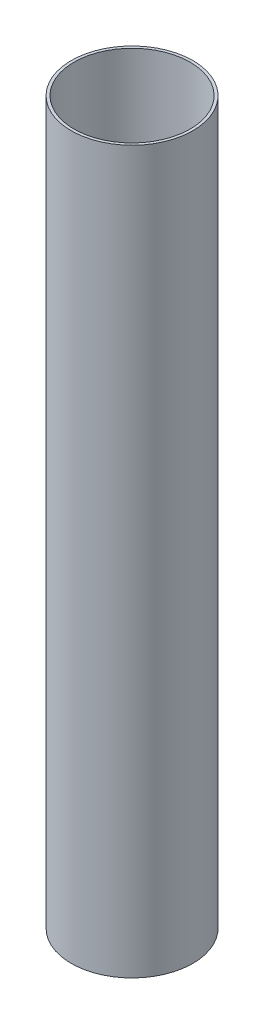
ISO-10303-21;
HEADER;
FILE_DESCRIPTION(('STEP AP214'),'2;1');
FILE_NAME('part.step','',(''),(''),'','','');
FILE_SCHEMA(('AUTOMOTIVE_DESIGN { 1 0 10303 214 1 1 1 1 }'));
ENDSEC;
DATA;
#1=APPLICATION_CONTEXT('core data for automotive mechanical design processes');
#2=APPLICATION_PROTOCOL_DEFINITION('international standard','automotive_design',2000,#1);
#3=PRODUCT_CONTEXT('',#1,'mechanical');
#4=PRODUCT('Part','Part','',(#3));
#5=PRODUCT_RELATED_PRODUCT_CATEGORY('part','',(#4));
#6=PRODUCT_DEFINITION_FORMATION('','',#4);
#7=PRODUCT_DEFINITION_CONTEXT('part definition',#1,'design');
#8=PRODUCT_DEFINITION('design','',#6,#7);
#9=PRODUCT_DEFINITION_SHAPE('','',#8);
#10=(LENGTH_UNIT() NAMED_UNIT(*) SI_UNIT(.MILLI.,.METRE.));
#11=(NAMED_UNIT(*) PLANE_ANGLE_UNIT() SI_UNIT($,.RADIAN.));
#12=(NAMED_UNIT(*) SI_UNIT($,.STERADIAN.) SOLID_ANGLE_UNIT());
#13=UNCERTAINTY_MEASURE_WITH_UNIT(LENGTH_MEASURE(1.E-05),#10,'distance_accuracy_value','');
#14=(GEOMETRIC_REPRESENTATION_CONTEXT(3) GLOBAL_UNCERTAINTY_ASSIGNED_CONTEXT((#13)) GLOBAL_UNIT_ASSIGNED_CONTEXT((#10,
#11,#12)) REPRESENTATION_CONTEXT('',''));
#15=CARTESIAN_POINT('',(0.,0.,0.));
#16=DIRECTION('',(0.,0.,1.));
#17=DIRECTION('',(1.,0.,0.));
#18=AXIS2_PLACEMENT_3D('',#15,#16,#17);
#19=CARTESIAN_POINT('',(0.,1299.,0.));
#20=DIRECTION('',(0.,1.,0.));
#21=DIRECTION('',(0.,0.,1.));
#22=AXIS2_PLACEMENT_3D('',#19,#20,#21);
#23=PLANE('',#22);
#24=CARTESIAN_POINT('',(0.,1299.,0.));
#25=DIRECTION('',(0.,1.,0.));
#26=DIRECTION('',(0.,0.,1.));
#27=AXIS2_PLACEMENT_3D('',#24,#25,#26);
#28=CIRCLE('',#27,109.55);
#29=CARTESIAN_POINT('',(0.,1299.,-109.55));
#30=VERTEX_POINT('',#29);
#31=EDGE_CURVE('E11',#30,#30,#28,.T.);
#32=ORIENTED_EDGE('',*,*,#31,.T.);
#33=EDGE_LOOP('',(#32));
#34=FACE_BOUND('',#33,.T.);
#35=CARTESIAN_POINT('',(0.,1299.,0.));
#36=DIRECTION('',(0.,1.,0.));
#37=DIRECTION('',(1.,0.,0.));
#38=AXIS2_PLACEMENT_3D('',#35,#36,#37);
#39=CIRCLE('',#38,104.55);
#40=CARTESIAN_POINT('',(0.,1299.,-104.55));
#41=VERTEX_POINT('',#40);
#42=EDGE_CURVE('E50',#41,#41,#39,.T.);
#43=ORIENTED_EDGE('',*,*,#42,.F.);
#44=EDGE_LOOP('',(#43));
#45=FACE_BOUND('',#44,.T.);
#46=ADVANCED_FACE('F39',(#34,#45),#23,.T.);
#47=CARTESIAN_POINT('',(0.,0.,0.));
#48=DIRECTION('',(0.,1.,0.));
#49=DIRECTION('',(0.,0.,1.));
#50=AXIS2_PLACEMENT_3D('',#47,#48,#49);
#51=PLANE('',#50);
#52=CARTESIAN_POINT('',(0.,0.,0.));
#53=DIRECTION('',(0.,1.,0.));
#54=DIRECTION('',(0.,0.,1.));
#55=AXIS2_PLACEMENT_3D('',#52,#53,#54);
#56=CIRCLE('',#55,109.55);
#57=CARTESIAN_POINT('',(0.,-2.22044604925031E-13,-109.55));
#58=VERTEX_POINT('',#57);
#59=EDGE_CURVE('E43',#58,#58,#56,.T.);
#60=ORIENTED_EDGE('',*,*,#59,.F.);
#61=EDGE_LOOP('',(#60));
#62=FACE_BOUND('',#61,.T.);
#63=CARTESIAN_POINT('',(0.,0.,0.));
#64=DIRECTION('',(0.,1.,0.));
#65=DIRECTION('',(1.,0.,0.));
#66=AXIS2_PLACEMENT_3D('',#63,#64,#65);
#67=CIRCLE('',#66,104.55);
#68=CARTESIAN_POINT('',(0.,-2.22044604925031E-13,-104.55));
#69=VERTEX_POINT('',#68);
#70=EDGE_CURVE('E52',#69,#69,#67,.T.);
#71=ORIENTED_EDGE('',*,*,#70,.T.);
#72=EDGE_LOOP('',(#71));
#73=FACE_BOUND('',#72,.T.);
#74=ADVANCED_FACE('F62',(#62,#73),#51,.F.);
#75=CARTESIAN_POINT('',(0.,1299.,0.));
#76=DIRECTION('',(0.,-1.,0.));
#77=DIRECTION('',(0.,0.,-1.));
#78=AXIS2_PLACEMENT_3D('',#75,#76,#77);
#79=CYLINDRICAL_SURFACE('',#78,109.55);
#80=CARTESIAN_POINT('',(0.,1299.,-109.55));
#81=CARTESIAN_POINT('',(0.,1285.46875,-109.55));
#82=CARTESIAN_POINT('',(0.,1271.9375,-109.55));
#83=CARTESIAN_POINT('',(0.,1244.875,-109.55));
#84=CARTESIAN_POINT('',(0.,1231.34375,-109.55));
#85=CARTESIAN_POINT('',(0.,1204.28125,-109.55));
#86=CARTESIAN_POINT('',(0.,1190.75,-109.55));
#87=CARTESIAN_POINT('',(0.,1163.6875,-109.55));
#88=CARTESIAN_POINT('',(0.,1150.15625,-109.55));
#89=CARTESIAN_POINT('',(0.,1123.09375,-109.55));
#90=CARTESIAN_POINT('',(0.,1109.5625,-109.55));
#91=CARTESIAN_POINT('',(0.,1082.5,-109.55));
#92=CARTESIAN_POINT('',(0.,1068.96875,-109.55));
#93=CARTESIAN_POINT('',(0.,1041.90625,-109.55));
#94=CARTESIAN_POINT('',(0.,1028.375,-109.55));
#95=CARTESIAN_POINT('',(0.,1001.3125,-109.55));
#96=CARTESIAN_POINT('',(0.,987.78125,-109.55));
#97=CARTESIAN_POINT('',(0.,960.71875,-109.55));
#98=CARTESIAN_POINT('',(0.,947.1875,-109.55));
#99=CARTESIAN_POINT('',(0.,920.125,-109.55));
#100=CARTESIAN_POINT('',(0.,906.59375,-109.55));
#101=CARTESIAN_POINT('',(0.,879.53125,-109.55));
#102=CARTESIAN_POINT('',(0.,866.,-109.55));
#103=CARTESIAN_POINT('',(0.,838.9375,-109.55));
#104=CARTESIAN_POINT('',(0.,825.40625,-109.55));
#105=CARTESIAN_POINT('',(0.,798.34375,-109.55));
#106=CARTESIAN_POINT('',(0.,784.8125,-109.55));
#107=CARTESIAN_POINT('',(0.,757.75,-109.55));
#108=CARTESIAN_POINT('',(0.,744.21875,-109.55));
#109=CARTESIAN_POINT('',(0.,717.15625,-109.55));
#110=CARTESIAN_POINT('',(0.,703.625,-109.55));
#111=CARTESIAN_POINT('',(0.,676.5625,-109.55));
#112=CARTESIAN_POINT('',(0.,663.03125,-109.55));
#113=CARTESIAN_POINT('',(0.,635.96875,-109.55));
#114=CARTESIAN_POINT('',(0.,622.4375,-109.55));
#115=CARTESIAN_POINT('',(0.,595.375,-109.55));
#116=CARTESIAN_POINT('',(0.,581.84375,-109.55));
#117=CARTESIAN_POINT('',(0.,554.78125,-109.55));
#118=CARTESIAN_POINT('',(0.,541.25,-109.55));
#119=CARTESIAN_POINT('',(0.,514.1875,-109.55));
#120=CARTESIAN_POINT('',(0.,500.65625,-109.55));
#121=CARTESIAN_POINT('',(0.,473.59375,-109.55));
#122=CARTESIAN_POINT('',(0.,460.0625,-109.55));
#123=CARTESIAN_POINT('',(0.,433.,-109.55));
#124=CARTESIAN_POINT('',(0.,419.46875,-109.55));
#125=CARTESIAN_POINT('',(0.,392.40625,-109.55));
#126=CARTESIAN_POINT('',(0.,378.875,-109.55));
#127=CARTESIAN_POINT('',(0.,351.8125,-109.55));
#128=CARTESIAN_POINT('',(0.,338.28125,-109.55));
#129=CARTESIAN_POINT('',(0.,311.21875,-109.55));
#130=CARTESIAN_POINT('',(0.,297.6875,-109.55));
#131=CARTESIAN_POINT('',(0.,270.625,-109.55));
#132=CARTESIAN_POINT('',(0.,257.09375,-109.55));
#133=CARTESIAN_POINT('',(0.,230.03125,-109.55));
#134=CARTESIAN_POINT('',(0.,216.5,-109.55));
#135=CARTESIAN_POINT('',(0.,189.4375,-109.55));
#136=CARTESIAN_POINT('',(0.,175.90625,-109.55));
#137=CARTESIAN_POINT('',(0.,148.84375,-109.55));
#138=CARTESIAN_POINT('',(0.,135.3125,-109.55));
#139=CARTESIAN_POINT('',(0.,108.25,-109.55));
#140=CARTESIAN_POINT('',(0.,94.7187499999997,-109.55));
#141=CARTESIAN_POINT('',(0.,67.6562499999997,-109.55));
#142=CARTESIAN_POINT('',(0.,54.1249999999998,-109.55));
#143=CARTESIAN_POINT('',(0.,27.0624999999998,-109.55));
#144=CARTESIAN_POINT('',(0.,13.5312499999998,-109.55));
#145=CARTESIAN_POINT('',(0.,-2.22044604925031E-13,-109.55));
#146=B_SPLINE_CURVE_WITH_KNOTS('',3,(#80,#81,#82,#83,#84,#85,#86,#87,#88,#89,#90,#91,#92,#93,
#94,#95,#96,#97,#98,#99,#100,#101,#102,#103,#104,#105,#106,#107,#108,#109,#110,#111,#112,#113,
#114,#115,#116,#117,#118,#119,#120,#121,#122,#123,#124,#125,#126,#127,#128,#129,#130,#131,#132,
#133,#134,#135,#136,#137,#138,#139,#140,#141,#142,#143,#144,#145),.UNSPECIFIED.,.F.,.F.,(4,2,2,
2,2,2,2,2,2,2,2,2,2,2,2,2,2,2,2,2,2,2,2,2,2,2,2,2,2,2,2,2,4),(0.,40.59375,81.1875,121.78125,
162.375,202.96875,243.5625,284.15625,324.75,365.34375,405.9375,446.53125,487.125,527.71875,
568.3125,608.90625,649.5,690.09375,730.6875,771.28125,811.875,852.46875,893.0625,933.65625,
974.25,1014.84375,1055.4375,1096.03125,1136.625,1177.21875,1217.8125,1258.40625,1299.),.UNSPECIFIED.);
#147=EDGE_CURVE('BSEAM41',#30,#58,#146,.T.);
#148=ORIENTED_EDGE('',*,*,#31,.F.);
#149=ORIENTED_EDGE('',*,*,#59,.T.);
#150=ORIENTED_EDGE('',*,*,#147,.T.);
#151=ORIENTED_EDGE('',*,*,#147,.F.);
#152=EDGE_LOOP('',(#148,#150,#149,#151));
#153=FACE_BOUND('',#152,.T.);
#154=ADVANCED_FACE('F41',(#153),#79,.T.);
#155=CARTESIAN_POINT('',(0.,1299.,0.));
#156=DIRECTION('',(0.,-1.,0.));
#157=DIRECTION('',(0.,0.,-1.));
#158=AXIS2_PLACEMENT_3D('',#155,#156,#157);
#159=CYLINDRICAL_SURFACE('',#158,104.55);
#160=CARTESIAN_POINT('',(0.,1299.,-104.55));
#161=CARTESIAN_POINT('',(0.,1285.46875,-104.55));
#162=CARTESIAN_POINT('',(0.,1271.9375,-104.55));
#163=CARTESIAN_POINT('',(0.,1244.875,-104.55));
#164=CARTESIAN_POINT('',(0.,1231.34375,-104.55));
#165=CARTESIAN_POINT('',(0.,1204.28125,-104.55));
#166=CARTESIAN_POINT('',(0.,1190.75,-104.55));
#167=CARTESIAN_POINT('',(0.,1163.6875,-104.55));
#168=CARTESIAN_POINT('',(0.,1150.15625,-104.55));
#169=CARTESIAN_POINT('',(0.,1123.09375,-104.55));
#170=CARTESIAN_POINT('',(0.,1109.5625,-104.55));
#171=CARTESIAN_POINT('',(0.,1082.5,-104.55));
#172=CARTESIAN_POINT('',(0.,1068.96875,-104.55));
#173=CARTESIAN_POINT('',(0.,1041.90625,-104.55));
#174=CARTESIAN_POINT('',(0.,1028.375,-104.55));
#175=CARTESIAN_POINT('',(0.,1001.3125,-104.55));
#176=CARTESIAN_POINT('',(0.,987.78125,-104.55));
#177=CARTESIAN_POINT('',(0.,960.71875,-104.55));
#178=CARTESIAN_POINT('',(0.,947.1875,-104.55));
#179=CARTESIAN_POINT('',(0.,920.125,-104.55));
#180=CARTESIAN_POINT('',(0.,906.59375,-104.55));
#181=CARTESIAN_POINT('',(0.,879.53125,-104.55));
#182=CARTESIAN_POINT('',(0.,866.,-104.55));
#183=CARTESIAN_POINT('',(0.,838.9375,-104.55));
#184=CARTESIAN_POINT('',(0.,825.40625,-104.55));
#185=CARTESIAN_POINT('',(0.,798.34375,-104.55));
#186=CARTESIAN_POINT('',(0.,784.8125,-104.55));
#187=CARTESIAN_POINT('',(0.,757.75,-104.55));
#188=CARTESIAN_POINT('',(0.,744.21875,-104.55));
#189=CARTESIAN_POINT('',(0.,717.15625,-104.55));
#190=CARTESIAN_POINT('',(0.,703.625,-104.55));
#191=CARTESIAN_POINT('',(0.,676.5625,-104.55));
#192=CARTESIAN_POINT('',(0.,663.03125,-104.55));
#193=CARTESIAN_POINT('',(0.,635.96875,-104.55));
#194=CARTESIAN_POINT('',(0.,622.4375,-104.55));
#195=CARTESIAN_POINT('',(0.,595.375,-104.55));
#196=CARTESIAN_POINT('',(0.,581.84375,-104.55));
#197=CARTESIAN_POINT('',(0.,554.78125,-104.55));
#198=CARTESIAN_POINT('',(0.,541.25,-104.55));
#199=CARTESIAN_POINT('',(0.,514.1875,-104.55));
#200=CARTESIAN_POINT('',(0.,500.65625,-104.55));
#201=CARTESIAN_POINT('',(0.,473.59375,-104.55));
#202=CARTESIAN_POINT('',(0.,460.0625,-104.55));
#203=CARTESIAN_POINT('',(0.,433.,-104.55));
#204=CARTESIAN_POINT('',(0.,419.46875,-104.55));
#205=CARTESIAN_POINT('',(0.,392.40625,-104.55));
#206=CARTESIAN_POINT('',(0.,378.875,-104.55));
#207=CARTESIAN_POINT('',(0.,351.8125,-104.55));
#208=CARTESIAN_POINT('',(0.,338.28125,-104.55));
#209=CARTESIAN_POINT('',(0.,311.21875,-104.55));
#210=CARTESIAN_POINT('',(0.,297.6875,-104.55));
#211=CARTESIAN_POINT('',(0.,270.625,-104.55));
#212=CARTESIAN_POINT('',(0.,257.09375,-104.55));
#213=CARTESIAN_POINT('',(0.,230.03125,-104.55));
#214=CARTESIAN_POINT('',(0.,216.5,-104.55));
#215=CARTESIAN_POINT('',(0.,189.4375,-104.55));
#216=CARTESIAN_POINT('',(0.,175.90625,-104.55));
#217=CARTESIAN_POINT('',(0.,148.84375,-104.55));
#218=CARTESIAN_POINT('',(0.,135.3125,-104.55));
#219=CARTESIAN_POINT('',(0.,108.25,-104.55));
#220=CARTESIAN_POINT('',(0.,94.7187499999997,-104.55));
#221=CARTESIAN_POINT('',(0.,67.6562499999997,-104.55));
#222=CARTESIAN_POINT('',(0.,54.1249999999998,-104.55));
#223=CARTESIAN_POINT('',(0.,27.0624999999998,-104.55));
#224=CARTESIAN_POINT('',(0.,13.5312499999998,-104.55));
#225=CARTESIAN_POINT('',(0.,-2.22044604925031E-13,-104.55));
#226=B_SPLINE_CURVE_WITH_KNOTS('',3,(#160,#161,#162,#163,#164,#165,#166,#167,#168,#169,#170,
#171,#172,#173,#174,#175,#176,#177,#178,#179,#180,#181,#182,#183,#184,#185,#186,#187,#188,#189,
#190,#191,#192,#193,#194,#195,#196,#197,#198,#199,#200,#201,#202,#203,#204,#205,#206,#207,#208,
#209,#210,#211,#212,#213,#214,#215,#216,#217,#218,#219,#220,#221,#222,#223,#224,#225),
.UNSPECIFIED.,.F.,.F.,(4,2,2,2,2,2,2,2,2,2,2,2,2,2,2,2,2,2,2,2,2,2,2,2,2,2,2,2,2,2,2,2,4),(0.,
40.5937500000002,81.1875000000002,121.78125,162.375,202.96875,243.5625,284.15625,324.75,
365.34375,405.9375,446.53125,487.125,527.71875,568.3125,608.90625,649.5,690.09375,730.6875,
771.28125,811.875,852.46875,893.0625,933.65625,974.25,1014.84375,1055.4375,1096.03125,1136.625,
1177.21875,1217.8125,1258.40625,1299.),.UNSPECIFIED.);
#227=EDGE_CURVE('BSEAM58',#41,#69,#226,.T.);
#228=ORIENTED_EDGE('',*,*,#42,.T.);
#229=ORIENTED_EDGE('',*,*,#70,.F.);
#230=ORIENTED_EDGE('',*,*,#227,.T.);
#231=ORIENTED_EDGE('',*,*,#227,.F.);
#232=EDGE_LOOP('',(#228,#230,#229,#231));
#233=FACE_BOUND('',#232,.T.);
#234=ADVANCED_FACE('F58',(#233),#159,.F.);
#235=CLOSED_SHELL('',(#46,#74,#154,#234));
#236=MANIFOLD_SOLID_BREP('B2',#235);
#237=ADVANCED_BREP_SHAPE_REPRESENTATION('',(#18,#236),#14);
#238=SHAPE_DEFINITION_REPRESENTATION(#9,#237);
ENDSEC;
END-ISO-10303-21;
